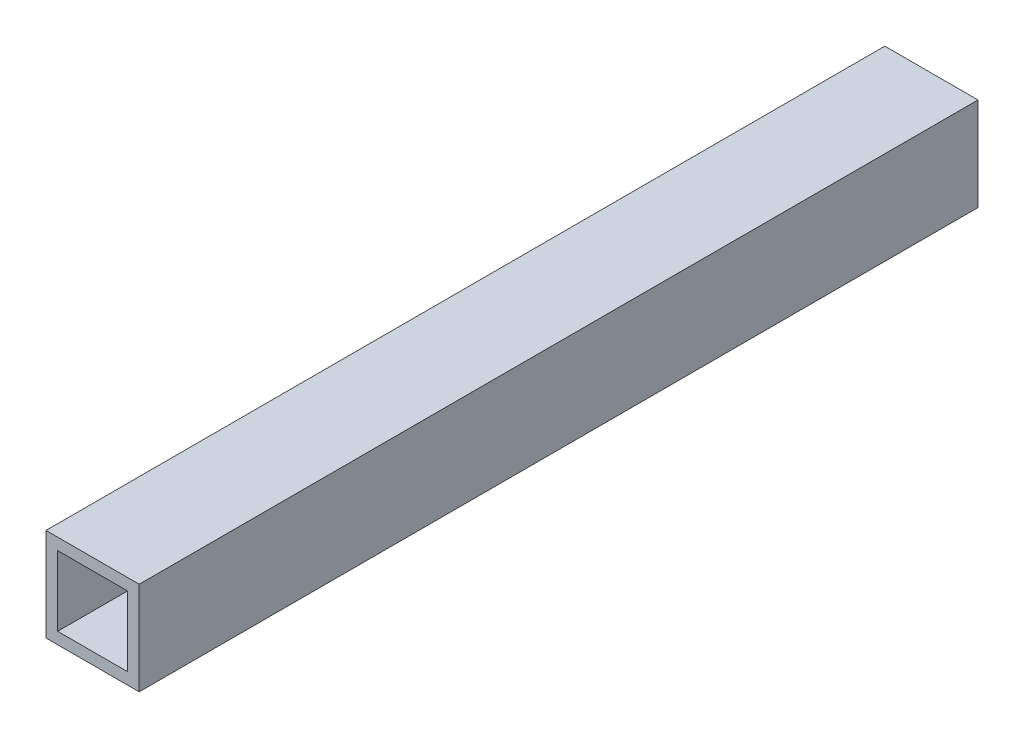
ISO-10303-21;
HEADER;
FILE_DESCRIPTION(('STEP AP214'),'2;1');
FILE_NAME('part.step','',(''),(''),'','','');
FILE_SCHEMA(('AUTOMOTIVE_DESIGN { 1 0 10303 214 1 1 1 1 }'));
ENDSEC;
DATA;
#1=APPLICATION_CONTEXT('core data for automotive mechanical design processes');
#2=APPLICATION_PROTOCOL_DEFINITION('international standard','automotive_design',2000,#1);
#3=PRODUCT_CONTEXT('',#1,'mechanical');
#4=PRODUCT('Part','Part','',(#3));
#5=PRODUCT_RELATED_PRODUCT_CATEGORY('part','',(#4));
#6=PRODUCT_DEFINITION_FORMATION('','',#4);
#7=PRODUCT_DEFINITION_CONTEXT('part definition',#1,'design');
#8=PRODUCT_DEFINITION('design','',#6,#7);
#9=PRODUCT_DEFINITION_SHAPE('','',#8);
#10=(LENGTH_UNIT() NAMED_UNIT(*) SI_UNIT(.MILLI.,.METRE.));
#11=(NAMED_UNIT(*) PLANE_ANGLE_UNIT() SI_UNIT($,.RADIAN.));
#12=(NAMED_UNIT(*) SI_UNIT($,.STERADIAN.) SOLID_ANGLE_UNIT());
#13=UNCERTAINTY_MEASURE_WITH_UNIT(LENGTH_MEASURE(1.E-05),#10,'distance_accuracy_value','');
#14=(GEOMETRIC_REPRESENTATION_CONTEXT(3) GLOBAL_UNCERTAINTY_ASSIGNED_CONTEXT((#13)) GLOBAL_UNIT_ASSIGNED_CONTEXT((#10,
#11,#12)) REPRESENTATION_CONTEXT('',''));
#15=CARTESIAN_POINT('',(0.,0.,0.));
#16=DIRECTION('',(0.,0.,1.));
#17=DIRECTION('',(1.,0.,0.));
#18=AXIS2_PLACEMENT_3D('',#15,#16,#17);
#19=CARTESIAN_POINT('',(0.,16.4973117995855,228.6));
#20=DIRECTION('',(0.,1.,0.));
#21=DIRECTION('',(0.,0.,1.));
#22=AXIS2_PLACEMENT_3D('',#19,#20,#21);
#23=PLANE('',#22);
#24=DIRECTION('',(1.,0.,0.));
#25=VECTOR('',#24,1.);
#26=CARTESIAN_POINT('',(0.,16.4973117995855,0.));
#27=LINE('',#26,#25);
#28=CARTESIAN_POINT('',(-91.7163151813154,16.4973117995855,0.));
#29=VERTEX_POINT('',#28);
#30=CARTESIAN_POINT('',(-72.6663151813154,16.4973117995855,0.));
#31=VERTEX_POINT('',#30);
#32=EDGE_CURVE('E156',#29,#31,#27,.T.);
#33=ORIENTED_EDGE('',*,*,#32,.T.);
#34=DIRECTION('',(0.,0.,-1.));
#35=VECTOR('',#34,1.);
#36=CARTESIAN_POINT('',(-72.6663151813154,16.4973117995855,228.6));
#37=LINE('',#36,#35);
#38=CARTESIAN_POINT('',(-72.6663151813154,16.4973117995855,228.6));
#39=VERTEX_POINT('',#38);
#40=EDGE_CURVE('E11',#39,#31,#37,.T.);
#41=ORIENTED_EDGE('',*,*,#40,.F.);
#42=DIRECTION('',(1.,0.,0.));
#43=VECTOR('',#42,1.);
#44=CARTESIAN_POINT('',(0.,16.4973117995855,228.6));
#45=LINE('',#44,#43);
#46=CARTESIAN_POINT('',(-91.7163151813154,16.4973117995855,228.6));
#47=VERTEX_POINT('',#46);
#48=EDGE_CURVE('E119',#47,#39,#45,.T.);
#49=ORIENTED_EDGE('',*,*,#48,.F.);
#50=DIRECTION('',(0.,0.,-1.));
#51=VECTOR('',#50,1.);
#52=CARTESIAN_POINT('',(-91.7163151813154,16.4973117995855,228.6));
#53=LINE('',#52,#51);
#54=EDGE_CURVE('E59',#47,#29,#53,.T.);
#55=ORIENTED_EDGE('',*,*,#54,.T.);
#56=EDGE_LOOP('',(#33,#41,#49,#55));
#57=FACE_BOUND('',#56,.T.);
#58=ADVANCED_FACE('F39',(#57),#23,.F.);
#59=CARTESIAN_POINT('',(-72.6663151813154,0.,228.6));
#60=DIRECTION('',(1.,0.,0.));
#61=DIRECTION('',(0.,0.,-1.));
#62=AXIS2_PLACEMENT_3D('',#59,#60,#61);
#63=PLANE('',#62);
#64=DIRECTION('',(0.,-1.,0.));
#65=VECTOR('',#64,1.);
#66=CARTESIAN_POINT('',(-72.6663151813154,0.,0.));
#67=LINE('',#66,#65);
#68=CARTESIAN_POINT('',(-72.6663151813154,-2.55268820041453,0.));
#69=VERTEX_POINT('',#68);
#70=EDGE_CURVE('E126',#31,#69,#67,.T.);
#71=ORIENTED_EDGE('',*,*,#70,.T.);
#72=DIRECTION('',(0.,0.,-1.));
#73=VECTOR('',#72,1.);
#74=CARTESIAN_POINT('',(-72.6663151813154,-2.55268820041453,228.6));
#75=LINE('',#74,#73);
#76=CARTESIAN_POINT('',(-72.6663151813154,-2.55268820041453,228.6));
#77=VERTEX_POINT('',#76);
#78=EDGE_CURVE('E50',#77,#69,#75,.T.);
#79=ORIENTED_EDGE('',*,*,#78,.F.);
#80=DIRECTION('',(0.,-1.,0.));
#81=VECTOR('',#80,1.);
#82=CARTESIAN_POINT('',(-72.6663151813154,0.,228.6));
#83=LINE('',#82,#81);
#84=EDGE_CURVE('E113',#39,#77,#83,.T.);
#85=ORIENTED_EDGE('',*,*,#84,.F.);
#86=ORIENTED_EDGE('',*,*,#40,.T.);
#87=EDGE_LOOP('',(#71,#79,#85,#86));
#88=FACE_BOUND('',#87,.T.);
#89=ADVANCED_FACE('F125',(#88),#63,.F.);
#90=CARTESIAN_POINT('',(0.,-2.55268820041453,228.6));
#91=DIRECTION('',(0.,1.,0.));
#92=DIRECTION('',(0.,0.,1.));
#93=AXIS2_PLACEMENT_3D('',#90,#91,#92);
#94=PLANE('',#93);
#95=DIRECTION('',(1.,0.,0.));
#96=VECTOR('',#95,1.);
#97=CARTESIAN_POINT('',(0.,-2.55268820041453,0.));
#98=LINE('',#97,#96);
#99=CARTESIAN_POINT('',(-91.7163151813154,-2.55268820041453,0.));
#100=VERTEX_POINT('',#99);
#101=EDGE_CURVE('E161',#100,#69,#98,.T.);
#102=ORIENTED_EDGE('',*,*,#101,.F.);
#103=DIRECTION('',(0.,0.,-1.));
#104=VECTOR('',#103,1.);
#105=CARTESIAN_POINT('',(-91.7163151813154,-2.55268820041453,228.6));
#106=LINE('',#105,#104);
#107=CARTESIAN_POINT('',(-91.7163151813154,-2.55268820041453,228.6));
#108=VERTEX_POINT('',#107);
#109=EDGE_CURVE('E85',#108,#100,#106,.T.);
#110=ORIENTED_EDGE('',*,*,#109,.F.);
#111=DIRECTION('',(1.,0.,0.));
#112=VECTOR('',#111,1.);
#113=CARTESIAN_POINT('',(0.,-2.55268820041453,228.6));
#114=LINE('',#113,#112);
#115=EDGE_CURVE('E118',#108,#77,#114,.T.);
#116=ORIENTED_EDGE('',*,*,#115,.T.);
#117=ORIENTED_EDGE('',*,*,#78,.T.);
#118=EDGE_LOOP('',(#102,#110,#116,#117));
#119=FACE_BOUND('',#118,.T.);
#120=ADVANCED_FACE('F131',(#119),#94,.T.);
#121=CARTESIAN_POINT('',(-69.4913151813153,0.,228.6));
#122=DIRECTION('',(1.,0.,0.));
#123=DIRECTION('',(0.,0.,-1.));
#124=AXIS2_PLACEMENT_3D('',#121,#122,#123);
#125=PLANE('',#124);
#126=DIRECTION('',(0.,-1.,0.));
#127=VECTOR('',#126,1.);
#128=CARTESIAN_POINT('',(-69.4913151813153,0.,0.));
#129=LINE('',#128,#127);
#130=CARTESIAN_POINT('',(-69.4913151813153,19.6723117995855,0.));
#131=VERTEX_POINT('',#130);
#132=CARTESIAN_POINT('',(-69.4913151813153,-5.72768820041453,0.));
#133=VERTEX_POINT('',#132);
#134=EDGE_CURVE('E140',#131,#133,#129,.T.);
#135=ORIENTED_EDGE('',*,*,#134,.F.);
#136=DIRECTION('',(0.,0.,-1.));
#137=VECTOR('',#136,1.);
#138=CARTESIAN_POINT('',(-69.4913151813153,19.6723117995855,228.6));
#139=LINE('',#138,#137);
#140=CARTESIAN_POINT('',(-69.4913151813153,19.6723117995855,228.6));
#141=VERTEX_POINT('',#140);
#142=EDGE_CURVE('E43',#141,#131,#139,.T.);
#143=ORIENTED_EDGE('',*,*,#142,.F.);
#144=DIRECTION('',(0.,-1.,0.));
#145=VECTOR('',#144,1.);
#146=CARTESIAN_POINT('',(-69.4913151813153,0.,228.6));
#147=LINE('',#146,#145);
#148=CARTESIAN_POINT('',(-69.4913151813153,-5.72768820041453,228.6));
#149=VERTEX_POINT('',#148);
#150=EDGE_CURVE('E168',#141,#149,#147,.T.);
#151=ORIENTED_EDGE('',*,*,#150,.T.);
#152=DIRECTION('',(0.,0.,-1.));
#153=VECTOR('',#152,1.);
#154=CARTESIAN_POINT('',(-69.4913151813153,-5.72768820041453,228.6));
#155=LINE('',#154,#153);
#156=EDGE_CURVE('E136',#149,#133,#155,.T.);
#157=ORIENTED_EDGE('',*,*,#156,.T.);
#158=EDGE_LOOP('',(#135,#143,#151,#157));
#159=FACE_BOUND('',#158,.T.);
#160=ADVANCED_FACE('F41',(#159),#125,.T.);
#161=CARTESIAN_POINT('',(0.,19.6723117995855,228.6));
#162=DIRECTION('',(0.,1.,0.));
#163=DIRECTION('',(0.,0.,1.));
#164=AXIS2_PLACEMENT_3D('',#161,#162,#163);
#165=PLANE('',#164);
#166=DIRECTION('',(1.,0.,0.));
#167=VECTOR('',#166,1.);
#168=CARTESIAN_POINT('',(0.,19.6723117995855,0.));
#169=LINE('',#168,#167);
#170=CARTESIAN_POINT('',(-94.8913151813154,19.6723117995855,0.));
#171=VERTEX_POINT('',#170);
#172=EDGE_CURVE('E144',#171,#131,#169,.T.);
#173=ORIENTED_EDGE('',*,*,#172,.F.);
#174=DIRECTION('',(0.,0.,-1.));
#175=VECTOR('',#174,1.);
#176=CARTESIAN_POINT('',(-94.8913151813154,19.6723117995855,228.6));
#177=LINE('',#176,#175);
#178=CARTESIAN_POINT('',(-94.8913151813154,19.6723117995855,228.6));
#179=VERTEX_POINT('',#178);
#180=EDGE_CURVE('E177',#179,#171,#177,.T.);
#181=ORIENTED_EDGE('',*,*,#180,.F.);
#182=DIRECTION('',(1.,0.,0.));
#183=VECTOR('',#182,1.);
#184=CARTESIAN_POINT('',(0.,19.6723117995855,228.6));
#185=LINE('',#184,#183);
#186=EDGE_CURVE('E188',#179,#141,#185,.T.);
#187=ORIENTED_EDGE('',*,*,#186,.T.);
#188=ORIENTED_EDGE('',*,*,#142,.T.);
#189=EDGE_LOOP('',(#173,#181,#187,#188));
#190=FACE_BOUND('',#189,.T.);
#191=ADVANCED_FACE('F186',(#190),#165,.T.);
#192=CARTESIAN_POINT('',(-94.8913151813154,-3.11074378793088E-13,228.6));
#193=DIRECTION('',(-1.,0.,0.));
#194=DIRECTION('',(0.,-1.,0.));
#195=AXIS2_PLACEMENT_3D('',#192,#193,#194);
#196=PLANE('',#195);
#197=DIRECTION('',(0.,1.,0.));
#198=VECTOR('',#197,1.);
#199=CARTESIAN_POINT('',(-94.8913151813154,-3.11074378793088E-13,0.));
#200=LINE('',#199,#198);
#201=CARTESIAN_POINT('',(-94.8913151813153,-5.72768820041453,0.));
#202=VERTEX_POINT('',#201);
#203=EDGE_CURVE('E148',#202,#171,#200,.T.);
#204=ORIENTED_EDGE('',*,*,#203,.F.);
#205=DIRECTION('',(0.,0.,-1.));
#206=VECTOR('',#205,1.);
#207=CARTESIAN_POINT('',(-94.8913151813153,-5.72768820041453,228.6));
#208=LINE('',#207,#206);
#209=CARTESIAN_POINT('',(-94.8913151813153,-5.72768820041453,228.6));
#210=VERTEX_POINT('',#209);
#211=EDGE_CURVE('E175',#210,#202,#208,.T.);
#212=ORIENTED_EDGE('',*,*,#211,.F.);
#213=DIRECTION('',(0.,1.,0.));
#214=VECTOR('',#213,1.);
#215=CARTESIAN_POINT('',(-94.8913151813154,-3.11074378793088E-13,228.6));
#216=LINE('',#215,#214);
#217=EDGE_CURVE('E195',#210,#179,#216,.T.);
#218=ORIENTED_EDGE('',*,*,#217,.T.);
#219=ORIENTED_EDGE('',*,*,#180,.T.);
#220=EDGE_LOOP('',(#204,#212,#218,#219));
#221=FACE_BOUND('',#220,.T.);
#222=ADVANCED_FACE('F193',(#221),#196,.T.);
#223=CARTESIAN_POINT('',(0.,-5.72768820041453,228.6));
#224=DIRECTION('',(0.,-1.,0.));
#225=DIRECTION('',(0.,0.,-1.));
#226=AXIS2_PLACEMENT_3D('',#223,#224,#225);
#227=PLANE('',#226);
#228=DIRECTION('',(-1.,0.,0.));
#229=VECTOR('',#228,1.);
#230=CARTESIAN_POINT('',(0.,-5.72768820041453,0.));
#231=LINE('',#230,#229);
#232=EDGE_CURVE('E152',#133,#202,#231,.T.);
#233=ORIENTED_EDGE('',*,*,#232,.F.);
#234=ORIENTED_EDGE('',*,*,#156,.F.);
#235=DIRECTION('',(-1.,0.,0.));
#236=VECTOR('',#235,1.);
#237=CARTESIAN_POINT('',(0.,-5.72768820041453,228.6));
#238=LINE('',#237,#236);
#239=EDGE_CURVE('E200',#149,#210,#238,.T.);
#240=ORIENTED_EDGE('',*,*,#239,.T.);
#241=ORIENTED_EDGE('',*,*,#211,.T.);
#242=EDGE_LOOP('',(#233,#234,#240,#241));
#243=FACE_BOUND('',#242,.T.);
#244=ADVANCED_FACE('F203',(#243),#227,.T.);
#245=CARTESIAN_POINT('',(-91.7163151813154,0.,228.6));
#246=DIRECTION('',(1.,0.,0.));
#247=DIRECTION('',(0.,0.,-1.));
#248=AXIS2_PLACEMENT_3D('',#245,#246,#247);
#249=PLANE('',#248);
#250=DIRECTION('',(0.,-1.,0.));
#251=VECTOR('',#250,1.);
#252=CARTESIAN_POINT('',(-91.7163151813154,0.,0.));
#253=LINE('',#252,#251);
#254=EDGE_CURVE('E164',#29,#100,#253,.T.);
#255=ORIENTED_EDGE('',*,*,#254,.F.);
#256=ORIENTED_EDGE('',*,*,#54,.F.);
#257=DIRECTION('',(0.,-1.,0.));
#258=VECTOR('',#257,1.);
#259=CARTESIAN_POINT('',(-91.7163151813154,0.,228.6));
#260=LINE('',#259,#258);
#261=EDGE_CURVE('E133',#47,#108,#260,.T.);
#262=ORIENTED_EDGE('',*,*,#261,.T.);
#263=ORIENTED_EDGE('',*,*,#109,.T.);
#264=EDGE_LOOP('',(#255,#256,#262,#263));
#265=FACE_BOUND('',#264,.T.);
#266=ADVANCED_FACE('F212',(#265),#249,.T.);
#267=CARTESIAN_POINT('',(0.,0.,228.6));
#268=DIRECTION('',(0.,0.,1.));
#269=DIRECTION('',(1.,0.,0.));
#270=AXIS2_PLACEMENT_3D('',#267,#268,#269);
#271=PLANE('',#270);
#272=ORIENTED_EDGE('',*,*,#150,.F.);
#273=ORIENTED_EDGE('',*,*,#186,.F.);
#274=ORIENTED_EDGE('',*,*,#217,.F.);
#275=ORIENTED_EDGE('',*,*,#239,.F.);
#276=EDGE_LOOP('',(#272,#273,#274,#275));
#277=FACE_BOUND('',#276,.T.);
#278=ORIENTED_EDGE('',*,*,#48,.T.);
#279=ORIENTED_EDGE('',*,*,#84,.T.);
#280=ORIENTED_EDGE('',*,*,#115,.F.);
#281=ORIENTED_EDGE('',*,*,#261,.F.);
#282=EDGE_LOOP('',(#278,#279,#280,#281));
#283=FACE_BOUND('',#282,.T.);
#284=ADVANCED_FACE('F115',(#277,#283),#271,.T.);
#285=CARTESIAN_POINT('',(0.,0.,0.));
#286=DIRECTION('',(0.,0.,1.));
#287=DIRECTION('',(1.,0.,0.));
#288=AXIS2_PLACEMENT_3D('',#285,#286,#287);
#289=PLANE('',#288);
#290=ORIENTED_EDGE('',*,*,#134,.T.);
#291=ORIENTED_EDGE('',*,*,#232,.T.);
#292=ORIENTED_EDGE('',*,*,#203,.T.);
#293=ORIENTED_EDGE('',*,*,#172,.T.);
#294=EDGE_LOOP('',(#290,#291,#292,#293));
#295=FACE_BOUND('',#294,.T.);
#296=ORIENTED_EDGE('',*,*,#32,.F.);
#297=ORIENTED_EDGE('',*,*,#254,.T.);
#298=ORIENTED_EDGE('',*,*,#101,.T.);
#299=ORIENTED_EDGE('',*,*,#70,.F.);
#300=EDGE_LOOP('',(#296,#297,#298,#299));
#301=FACE_BOUND('',#300,.T.);
#302=ADVANCED_FACE('F191',(#295,#301),#289,.F.);
#303=CLOSED_SHELL('',(#58,#89,#120,#160,#191,#222,#244,#266,#284,#302));
#304=MANIFOLD_SOLID_BREP('B2',#303);
#305=ADVANCED_BREP_SHAPE_REPRESENTATION('',(#18,#304),#14);
#306=SHAPE_DEFINITION_REPRESENTATION(#9,#305);
ENDSEC;
END-ISO-10303-21;
